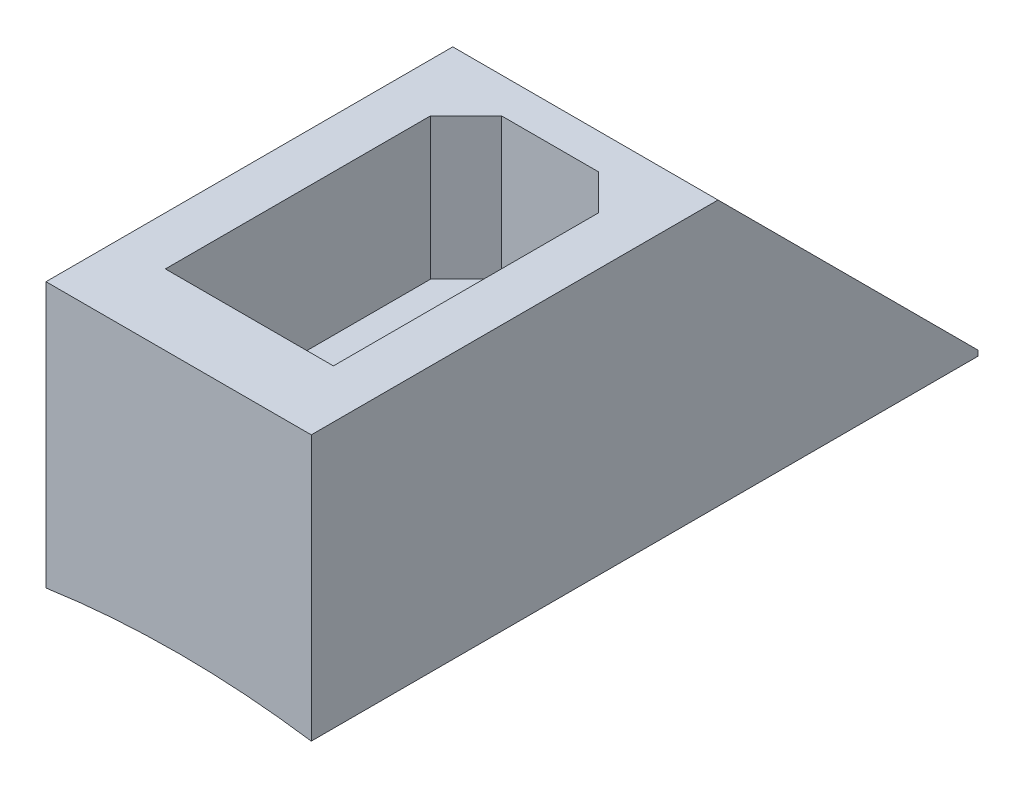
ISO-10303-21;
HEADER;
FILE_DESCRIPTION(('STEP AP214'),'2;1');
FILE_NAME('part.step','',(''),(''),'','','');
FILE_SCHEMA(('AUTOMOTIVE_DESIGN { 1 0 10303 214 1 1 1 1 }'));
ENDSEC;
DATA;
#1=APPLICATION_CONTEXT('core data for automotive mechanical design processes');
#2=APPLICATION_PROTOCOL_DEFINITION('international standard','automotive_design',2000,#1);
#3=PRODUCT_CONTEXT('',#1,'mechanical');
#4=PRODUCT('Part','Part','',(#3));
#5=PRODUCT_RELATED_PRODUCT_CATEGORY('part','',(#4));
#6=PRODUCT_DEFINITION_FORMATION('','',#4);
#7=PRODUCT_DEFINITION_CONTEXT('part definition',#1,'design');
#8=PRODUCT_DEFINITION('design','',#6,#7);
#9=PRODUCT_DEFINITION_SHAPE('','',#8);
#10=(LENGTH_UNIT() NAMED_UNIT(*) SI_UNIT(.MILLI.,.METRE.));
#11=(NAMED_UNIT(*) PLANE_ANGLE_UNIT() SI_UNIT($,.RADIAN.));
#12=(NAMED_UNIT(*) SI_UNIT($,.STERADIAN.) SOLID_ANGLE_UNIT());
#13=UNCERTAINTY_MEASURE_WITH_UNIT(LENGTH_MEASURE(1.E-05),#10,'distance_accuracy_value','');
#14=(GEOMETRIC_REPRESENTATION_CONTEXT(3) GLOBAL_UNCERTAINTY_ASSIGNED_CONTEXT((#13)) GLOBAL_UNIT_ASSIGNED_CONTEXT((#10,
#11,#12)) REPRESENTATION_CONTEXT('',''));
#15=CARTESIAN_POINT('',(0.,0.,0.));
#16=DIRECTION('',(0.,0.,1.));
#17=DIRECTION('',(1.,0.,0.));
#18=AXIS2_PLACEMENT_3D('',#15,#16,#17);
#19=CARTESIAN_POINT('',(7.5,-42.0748485916022,-12.7));
#20=DIRECTION('',(0.,0.,-1.));
#21=DIRECTION('',(-1.,0.,0.));
#22=AXIS2_PLACEMENT_3D('',#19,#20,#21);
#23=PLANE('',#22);
#24=DIRECTION('',(0.,1.,0.));
#25=VECTOR('',#24,1.);
#26=CARTESIAN_POINT('',(0.,23.9387755102041,-12.7));
#27=LINE('',#26,#25);
#28=CARTESIAN_POINT('',(0.,8.93877551020407,-12.7));
#29=VERTEX_POINT('',#28);
#30=CARTESIAN_POINT('',(0.,9.23877551020381,-12.7));
#31=VERTEX_POINT('',#30);
#32=EDGE_CURVE('E150',#29,#31,#27,.T.);
#33=ORIENTED_EDGE('',*,*,#32,.T.);
#34=DIRECTION('',(1.,0.,0.));
#35=VECTOR('',#34,1.);
#36=CARTESIAN_POINT('',(15.,9.23877551020381,-12.7));
#37=LINE('',#36,#35);
#38=CARTESIAN_POINT('',(2.44511864244638,9.23877551020381,-12.7));
#39=VERTEX_POINT('',#38);
#40=EDGE_CURVE('E262',#31,#39,#37,.T.);
#41=ORIENTED_EDGE('',*,*,#40,.T.);
#42=CARTESIAN_POINT('',(7.5,-42.0748485916022,-12.7));
#43=DIRECTION('',(0.,0.,1.));
#44=DIRECTION('',(-1.,0.,0.));
#45=AXIS2_PLACEMENT_3D('',#42,#43,#44);
#46=CIRCLE('',#45,51.5620000000038);
#47=EDGE_CURVE('E136',#39,#29,#46,.T.);
#48=ORIENTED_EDGE('',*,*,#47,.T.);
#49=EDGE_LOOP('',(#33,#41,#48));
#50=FACE_BOUND('',#49,.T.);
#51=ADVANCED_FACE('F39',(#50),#23,.T.);
#52=CARTESIAN_POINT('',(7.5,8.93877551020407,16.175));
#53=DIRECTION('',(0.,1.,0.));
#54=DIRECTION('',(0.,0.,1.));
#55=AXIS2_PLACEMENT_3D('',#52,#53,#54);
#56=CYLINDRICAL_SURFACE('',#55,2.75);
#57=CARTESIAN_POINT('',(7.5,9.48715140840162,18.925));
#58=CARTESIAN_POINT('',(7.65435097895577,9.48715042879058,18.9249931929181));
#59=CARTESIAN_POINT('',(7.80881107965169,9.48645091312312,18.9119613177398));
#60=CARTESIAN_POINT('',(8.11346929754863,9.48372765547839,18.8601599459866));
#61=CARTESIAN_POINT('',(8.26366219171289,9.48170235794201,18.8213602148341));
#62=CARTESIAN_POINT('',(8.55532870499744,9.4765567382875,18.7191380401168));
#63=CARTESIAN_POINT('',(8.69680676272525,9.47343697910908,18.6557282530306));
#64=CARTESIAN_POINT('',(8.96707282803915,9.46645368008504,18.5061056515496));
#65=CARTESIAN_POINT('',(9.09586379963759,9.46259031458997,18.4198981806725));
#66=CARTESIAN_POINT('',(9.33728329279081,9.45454944362787,18.2270194427513));
#67=CARTESIAN_POINT('',(9.44989567430701,9.45037163070635,18.1203279849908));
#68=CARTESIAN_POINT('',(9.65562364501314,9.44217537337076,17.8895505811323));
#69=CARTESIAN_POINT('',(9.74873843335047,9.43815693550842,17.7654639208856));
#70=CARTESIAN_POINT('',(9.91287419703132,9.43073033923021,17.5033316683625));
#71=CARTESIAN_POINT('',(9.98388231326114,9.42732253649877,17.3652780133238));
#72=CARTESIAN_POINT('',(10.1017066470424,9.42150532292135,17.0791872947789));
#73=CARTESIAN_POINT('',(10.1485230668944,9.41909590372651,16.931150314769));
#74=CARTESIAN_POINT('',(10.2165917329869,9.41554999085338,16.6294459045482));
#75=CARTESIAN_POINT('',(10.2378684931383,9.41441227661788,16.4757840195878));
#76=CARTESIAN_POINT('',(10.2543295160921,9.41353441043193,16.1670658180619));
#77=CARTESIAN_POINT('',(10.2495140067396,9.41379424627768,16.0120095136848));
#78=CARTESIAN_POINT('',(10.2139475826552,9.41568104474991,15.7050706766574));
#79=CARTESIAN_POINT('',(10.1832231635176,9.41730661071425,15.553185064064));
#80=CARTESIAN_POINT('',(10.0967521424871,9.42173945894075,15.2567302733335));
#81=CARTESIAN_POINT('',(10.0410054240059,9.42454674670901,15.1121611292901));
#82=CARTESIAN_POINT('',(9.90604203362947,9.43102825278204,14.8343577581608));
#83=CARTESIAN_POINT('',(9.82681329690256,9.43470291653804,14.7011294032665));
#84=CARTESIAN_POINT('',(9.64714365934119,9.44250456684383,14.4498536924823));
#85=CARTESIAN_POINT('',(9.54670258704188,9.44663155704976,14.3318064593177));
#86=CARTESIAN_POINT('',(9.3273099842487,9.4548789312021,14.1140897211129));
#87=CARTESIAN_POINT('',(9.2083355130222,9.4589993004797,14.0144433313669));
#88=CARTESIAN_POINT('',(8.9553339342862,9.46676408594595,13.8365350385265));
#89=CARTESIAN_POINT('',(8.82130682273158,9.47040850200671,13.7582731411789));
#90=CARTESIAN_POINT('',(8.54199085559443,9.47681085492425,13.6253575528161));
#91=CARTESIAN_POINT('',(8.39670160739012,9.47956876085816,13.5707046852984));
#92=CARTESIAN_POINT('',(8.09899165710637,9.48388684287899,13.4865737408279));
#93=CARTESIAN_POINT('',(7.94657101574728,9.48544702916194,13.457095449567));
#94=CARTESIAN_POINT('',(7.63912558388247,9.48719253164091,13.4241789649785));
#95=CARTESIAN_POINT('',(7.4841042253125,9.48737953575447,13.4207088023124));
#96=CARTESIAN_POINT('',(7.17568146356683,9.48636208243199,13.439823625827));
#97=CARTESIAN_POINT('',(7.02228005428412,9.48515763024347,13.462408513748));
#98=CARTESIAN_POINT('',(6.72154139293456,9.48149399428106,13.5329658736579));
#99=CARTESIAN_POINT('',(6.57420070258586,9.47903553282617,13.580923731212));
#100=CARTESIAN_POINT('',(6.28965997376305,9.47314061708192,13.7008508604269));
#101=CARTESIAN_POINT('',(6.15246000176205,9.46970415638242,13.7728202894682));
#102=CARTESIAN_POINT('',(5.89194861665342,9.46223551030648,13.9388093493237));
#103=CARTESIAN_POINT('',(5.76865086268431,9.45820274789089,14.0328503911174));
#104=CARTESIAN_POINT('',(5.53958126313574,9.44999751485844,14.2402819432382));
#105=CARTESIAN_POINT('',(5.43380954467566,9.44582504322852,14.3536725938993));
#106=CARTESIAN_POINT('',(5.24268669267917,9.43780583435452,14.5967222469676));
#107=CARTESIAN_POINT('',(5.15735625715243,9.43395942979692,14.7263975377833));
#108=CARTESIAN_POINT('',(5.00967967890251,9.42703134890772,14.9982532746573));
#109=CARTESIAN_POINT('',(4.94733342587105,9.423949668906,15.1404336606957));
#110=CARTESIAN_POINT('',(4.84743102396193,9.41890093097206,15.4331871922195));
#111=CARTESIAN_POINT('',(4.80986172133218,9.41693328169446,15.5837558383698));
#112=CARTESIAN_POINT('',(4.76053666884104,9.41433283608672,15.88907464633));
#113=CARTESIAN_POINT('',(4.74878074563551,9.41370003079273,16.0438247800531));
#114=CARTESIAN_POINT('',(4.75141779420301,9.41384085297849,16.3529078127267));
#115=CARTESIAN_POINT('',(4.76577821088679,9.41461272946554,16.5072409912899));
#116=CARTESIAN_POINT('',(4.82017295351543,9.41747222009253,16.8113018346929));
#117=CARTESIAN_POINT('',(4.86020732785864,9.41955983671278,16.9610294908502));
#118=CARTESIAN_POINT('',(4.96480671044008,9.42481512162699,17.2516353464725));
#119=CARTESIAN_POINT('',(5.02937182481094,9.42798279459382,17.3925135076469));
#120=CARTESIAN_POINT('',(5.1811946777554,9.43504109497196,17.6614330106267));
#121=CARTESIAN_POINT('',(5.26845174670824,9.43893170104915,17.7894747310704));
#122=CARTESIAN_POINT('',(5.46329947349179,9.44700295399372,18.0292501624672));
#123=CARTESIAN_POINT('',(5.57091310812096,9.45118392519321,18.1409651901597));
#124=CARTESIAN_POINT('',(5.80339872861173,9.45936225115668,18.3447796450952));
#125=CARTESIAN_POINT('',(5.92827494794828,9.46335956055809,18.4368742465046));
#126=CARTESIAN_POINT('',(6.19184971833319,9.47072323184012,18.59888269433));
#127=CARTESIAN_POINT('',(6.33056231897978,9.47408894219181,18.6687736874338));
#128=CARTESIAN_POINT('',(6.61766796202361,9.47980070468509,18.7841902664387));
#129=CARTESIAN_POINT('',(6.7660493611001,9.48214795809221,18.8297445721106));
#130=CARTESIAN_POINT('',(7.01279103323716,9.48493888018015,18.8832723426892));
#131=CARTESIAN_POINT('',(7.10955389516987,9.48576492190564,18.8989001740057));
#132=CARTESIAN_POINT('',(7.3041965319372,9.48687149649271,18.9197661568545));
#133=CARTESIAN_POINT('',(7.40207630567765,9.48715202988865,18.9250043185642));
#134=CARTESIAN_POINT('',(7.5,9.48715140840162,18.925));
#135=B_SPLINE_CURVE_WITH_KNOTS('',3,(#57,#58,#59,#60,#61,#62,#63,#64,#65,#66,#67,#68,#69,#70,
#71,#72,#73,#74,#75,#76,#77,#78,#79,#80,#81,#82,#83,#84,#85,#86,#87,#88,#89,#90,#91,#92,#93,#94,
#95,#96,#97,#98,#99,#100,#101,#102,#103,#104,#105,#106,#107,#108,#109,#110,#111,#112,#113,#114,
#115,#116,#117,#118,#119,#120,#121,#122,#123,#124,#125,#126,#127,#128,#129,#130,#131,#132,#133,
#134),.UNSPECIFIED.,.T.,.F.,(4,2,2,2,2,2,2,2,2,2,2,2,2,2,2,2,2,2,2,2,2,2,2,2,2,2,2,2,2,2,2,2,2,
2,2,2,2,2,4),(0.,0.462695473602192,0.925934809935523,1.38893622619541,1.8518292162303,
2.31518083643747,2.77855148481821,3.2421911673917,3.70582697276263,4.16901740656119,
4.63220379565511,5.09491708353755,5.55763252740025,6.02058612329231,6.4835434615023,
6.94707847205072,7.41061360716591,7.87416490936518,8.33771226536815,8.80068973274695,
9.26366545413536,9.72637479858098,10.1890871758488,10.6522502847816,11.1154167529703,
11.5790502408673,12.0426815036128,12.5060664321518,12.9694482489203,13.4322528371115,
13.895058297745,14.3578657607361,14.8206595682119,15.2839788898719,15.7474120381708,
16.2113206463371,16.6746805789472,16.9682251668143,17.2617694671349),.UNSPECIFIED.);
#136=CARTESIAN_POINT('',(7.5,9.48715140840162,18.925));
#137=VERTEX_POINT('',#136);
#138=EDGE_CURVE('E186',#137,#137,#135,.T.);
#139=ORIENTED_EDGE('',*,*,#138,.F.);
#140=EDGE_LOOP('',(#139));
#141=FACE_BOUND('',#140,.T.);
#142=CARTESIAN_POINT('',(7.5,15.9387755102041,16.175));
#143=DIRECTION('',(0.,1.,0.));
#144=DIRECTION('',(0.,0.,1.));
#145=AXIS2_PLACEMENT_3D('',#142,#143,#144);
#146=CIRCLE('',#145,2.75);
#147=CARTESIAN_POINT('',(7.5,15.9387755102041,18.925));
#148=VERTEX_POINT('',#147);
#149=EDGE_CURVE('E183',#148,#148,#146,.F.);
#150=ORIENTED_EDGE('',*,*,#149,.F.);
#151=EDGE_LOOP('',(#150));
#152=FACE_BOUND('',#151,.T.);
#153=ADVANCED_FACE('F216',(#141,#152),#56,.F.);
#154=CARTESIAN_POINT('',(7.5,8.93877551020407,8.825));
#155=DIRECTION('',(0.,1.,0.));
#156=DIRECTION('',(0.,0.,1.));
#157=AXIS2_PLACEMENT_3D('',#154,#155,#156);
#158=CYLINDRICAL_SURFACE('',#157,2.75);
#159=CARTESIAN_POINT('',(7.5,9.48715140840162,11.575));
#160=CARTESIAN_POINT('',(7.65435097895577,9.48715042879058,11.5749931929181));
#161=CARTESIAN_POINT('',(7.80881107965169,9.48645091312312,11.5619613177398));
#162=CARTESIAN_POINT('',(8.11346929754863,9.48372765547839,11.5101599459866));
#163=CARTESIAN_POINT('',(8.26366219171289,9.48170235794201,11.4713602148341));
#164=CARTESIAN_POINT('',(8.55532870499744,9.4765567382875,11.3691380401168));
#165=CARTESIAN_POINT('',(8.69680676272524,9.47343697910908,11.3057282530306));
#166=CARTESIAN_POINT('',(8.96707282803915,9.46645368008505,11.1561056515496));
#167=CARTESIAN_POINT('',(9.09586379963759,9.46259031458997,11.0698981806725));
#168=CARTESIAN_POINT('',(9.33728329279081,9.45454944362787,10.8770194427513));
#169=CARTESIAN_POINT('',(9.44989567430701,9.45037163070635,10.7703279849908));
#170=CARTESIAN_POINT('',(9.65562364501314,9.44217537337076,10.5395505811323));
#171=CARTESIAN_POINT('',(9.74873843335047,9.43815693550841,10.4154639208856));
#172=CARTESIAN_POINT('',(9.91287419703132,9.43073033923021,10.1533316683625));
#173=CARTESIAN_POINT('',(9.98388231326115,9.42732253649878,10.0152780133238));
#174=CARTESIAN_POINT('',(10.1017066470424,9.42150532292136,9.72918729477885));
#175=CARTESIAN_POINT('',(10.1485230668944,9.41909590372652,9.58115031476895));
#176=CARTESIAN_POINT('',(10.2165917329869,9.41554999085338,9.27944590454819));
#177=CARTESIAN_POINT('',(10.2378684931383,9.41441227661788,9.12578401958776));
#178=CARTESIAN_POINT('',(10.2543295160921,9.41353441043193,8.81706581806195));
#179=CARTESIAN_POINT('',(10.2495140067396,9.41379424627768,8.66200951368484));
#180=CARTESIAN_POINT('',(10.2139475826552,9.41568104474991,8.35507067665737));
#181=CARTESIAN_POINT('',(10.1832231635176,9.41730661071424,8.20318506406405));
#182=CARTESIAN_POINT('',(10.0967521424871,9.42173945894075,7.90673027333355));
#183=CARTESIAN_POINT('',(10.0410054240059,9.42454674670901,7.76216112929008));
#184=CARTESIAN_POINT('',(9.90604203362948,9.43102825278204,7.48435775816076));
#185=CARTESIAN_POINT('',(9.82681329690256,9.43470291653804,7.35112940326651));
#186=CARTESIAN_POINT('',(9.64714365934119,9.44250456684383,7.09985369248229));
#187=CARTESIAN_POINT('',(9.54670258704188,9.44663155704976,6.98180645931771));
#188=CARTESIAN_POINT('',(9.3273099842487,9.4548789312021,6.7640897211129));
#189=CARTESIAN_POINT('',(9.2083355130222,9.4589993004797,6.66444333136686));
#190=CARTESIAN_POINT('',(8.9553339342862,9.46676408594595,6.48653503852649));
#191=CARTESIAN_POINT('',(8.82130682273159,9.47040850200671,6.40827314117887));
#192=CARTESIAN_POINT('',(8.54199085559443,9.47681085492425,6.27535755281611));
#193=CARTESIAN_POINT('',(8.39670160739012,9.47956876085816,6.2207046852984));
#194=CARTESIAN_POINT('',(8.09899165710637,9.483886842879,6.13657374082794));
#195=CARTESIAN_POINT('',(7.94657101574727,9.48544702916195,6.10709544956703));
#196=CARTESIAN_POINT('',(7.63912558388247,9.48719253164091,6.07417896497851));
#197=CARTESIAN_POINT('',(7.4841042253125,9.48737953575446,6.07070880231238));
#198=CARTESIAN_POINT('',(7.17568146356683,9.48636208243199,6.08982362582697));
#199=CARTESIAN_POINT('',(7.02228005428412,9.48515763024346,6.11240851374802));
#200=CARTESIAN_POINT('',(6.72154139293456,9.48149399428105,6.18296587365787));
#201=CARTESIAN_POINT('',(6.57420070258586,9.47903553282617,6.23092373121199));
#202=CARTESIAN_POINT('',(6.28965997376305,9.47314061708192,6.35085086042694));
#203=CARTESIAN_POINT('',(6.15246000176205,9.46970415638243,6.42282028946819));
#204=CARTESIAN_POINT('',(5.89194861665342,9.46223551030649,6.5888093493237));
#205=CARTESIAN_POINT('',(5.76865086268431,9.45820274789089,6.68285039111736));
#206=CARTESIAN_POINT('',(5.53958126313574,9.44999751485844,6.89028194323817));
#207=CARTESIAN_POINT('',(5.43380954467567,9.44582504322852,7.0036725938993));
#208=CARTESIAN_POINT('',(5.24268669267917,9.43780583435452,7.24672224696761));
#209=CARTESIAN_POINT('',(5.15735625715243,9.43395942979692,7.37639753778334));
#210=CARTESIAN_POINT('',(5.00967967890251,9.42703134890772,7.64825327465733));
#211=CARTESIAN_POINT('',(4.94733342587105,9.423949668906,7.79043366069567));
#212=CARTESIAN_POINT('',(4.84743102396193,9.41890093097206,8.08318719221949));
#213=CARTESIAN_POINT('',(4.80986172133218,9.41693328169446,8.23375583836979));
#214=CARTESIAN_POINT('',(4.76053666884104,9.41433283608672,8.53907464633004));
#215=CARTESIAN_POINT('',(4.74878074563551,9.41370003079273,8.69382478005307));
#216=CARTESIAN_POINT('',(4.75141779420301,9.41384085297849,9.0029078127267));
#217=CARTESIAN_POINT('',(4.76577821088679,9.41461272946554,9.15724099128986));
#218=CARTESIAN_POINT('',(4.82017295351543,9.41747222009253,9.46130183469286));
#219=CARTESIAN_POINT('',(4.86020732785864,9.41955983671279,9.61102949085021));
#220=CARTESIAN_POINT('',(4.96480671044008,9.42481512162699,9.9016353464725));
#221=CARTESIAN_POINT('',(5.02937182481094,9.42798279459382,10.0425135076469));
#222=CARTESIAN_POINT('',(5.1811946777554,9.43504109497196,10.3114330106267));
#223=CARTESIAN_POINT('',(5.26845174670824,9.43893170104915,10.4394747310704));
#224=CARTESIAN_POINT('',(5.46329947349179,9.44700295399372,10.6792501624672));
#225=CARTESIAN_POINT('',(5.57091310812096,9.45118392519321,10.7909651901597));
#226=CARTESIAN_POINT('',(5.80339872861173,9.45936225115668,10.9947796450952));
#227=CARTESIAN_POINT('',(5.92827494794828,9.46335956055809,11.0868742465046));
#228=CARTESIAN_POINT('',(6.19184971833319,9.47072323184012,11.24888269433));
#229=CARTESIAN_POINT('',(6.33056231897978,9.47408894219181,11.3187736874338));
#230=CARTESIAN_POINT('',(6.61766796202361,9.47980070468509,11.4341902664387));
#231=CARTESIAN_POINT('',(6.7660493611001,9.48214795809221,11.4797445721106));
#232=CARTESIAN_POINT('',(7.01279103323716,9.48493888018015,11.5332723426892));
#233=CARTESIAN_POINT('',(7.10955389516987,9.48576492190564,11.5489001740057));
#234=CARTESIAN_POINT('',(7.3041965319372,9.48687149649271,11.5697661568545));
#235=CARTESIAN_POINT('',(7.40207630567765,9.48715202988865,11.5750043185642));
#236=CARTESIAN_POINT('',(7.5,9.48715140840162,11.575));
#237=B_SPLINE_CURVE_WITH_KNOTS('',3,(#159,#160,#161,#162,#163,#164,#165,#166,#167,#168,#169,
#170,#171,#172,#173,#174,#175,#176,#177,#178,#179,#180,#181,#182,#183,#184,#185,#186,#187,#188,
#189,#190,#191,#192,#193,#194,#195,#196,#197,#198,#199,#200,#201,#202,#203,#204,#205,#206,#207,
#208,#209,#210,#211,#212,#213,#214,#215,#216,#217,#218,#219,#220,#221,#222,#223,#224,#225,#226,
#227,#228,#229,#230,#231,#232,#233,#234,#235,#236),.UNSPECIFIED.,.T.,.F.,(4,2,2,2,2,2,2,2,2,2,2,
2,2,2,2,2,2,2,2,2,2,2,2,2,2,2,2,2,2,2,2,2,2,2,2,2,2,2,4),(0.,0.462695473602192,
0.925934809935522,1.38893622619541,1.8518292162303,2.31518083643747,2.77855148481821,
3.2421911673917,3.70582697276264,4.16901740656119,4.6322037956551,5.09491708353755,
5.55763252740025,6.02058612329232,6.4835434615023,6.94707847205072,7.41061360716591,
7.87416490936518,8.33771226536815,8.80068973274695,9.26366545413537,9.72637479858099,
10.1890871758488,10.6522502847816,11.1154167529703,11.5790502408673,12.0426815036128,
12.5060664321518,12.9694482489203,13.4322528371115,13.895058297745,14.3578657607361,
14.8206595682119,15.2839788898719,15.7474120381709,16.2113206463371,16.6746805789472,
16.9682251668144,17.2617694671349),.UNSPECIFIED.);
#238=CARTESIAN_POINT('',(7.5,9.48715140840162,11.575));
#239=VERTEX_POINT('',#238);
#240=EDGE_CURVE('E188',#239,#239,#237,.T.);
#241=ORIENTED_EDGE('',*,*,#240,.F.);
#242=EDGE_LOOP('',(#241));
#243=FACE_BOUND('',#242,.T.);
#244=CARTESIAN_POINT('',(7.5,15.9387755102041,8.825));
#245=DIRECTION('',(0.,1.,0.));
#246=DIRECTION('',(0.,0.,1.));
#247=AXIS2_PLACEMENT_3D('',#244,#245,#246);
#248=CIRCLE('',#247,2.75);
#249=CARTESIAN_POINT('',(7.5,15.9387755102041,11.575));
#250=VERTEX_POINT('',#249);
#251=EDGE_CURVE('E180',#250,#250,#248,.F.);
#252=ORIENTED_EDGE('',*,*,#251,.F.);
#253=EDGE_LOOP('',(#252));
#254=FACE_BOUND('',#253,.T.);
#255=ADVANCED_FACE('F219',(#243,#254),#158,.F.);
#256=CARTESIAN_POINT('',(0.,0.,25.));
#257=DIRECTION('',(1.,0.,0.));
#258=DIRECTION('',(0.,0.,-1.));
#259=AXIS2_PLACEMENT_3D('',#256,#257,#258);
#260=PLANE('',#259);
#261=DIRECTION('',(0.,0.,-1.));
#262=VECTOR('',#261,1.);
#263=CARTESIAN_POINT('',(0.,23.9387755102041,25.));
#264=LINE('',#263,#262);
#265=CARTESIAN_POINT('',(0.,23.9387755102041,25.));
#266=VERTEX_POINT('',#265);
#267=CARTESIAN_POINT('',(0.,23.9387755102041,2.00000000000011));
#268=VERTEX_POINT('',#267);
#269=EDGE_CURVE('E197',#266,#268,#264,.T.);
#270=ORIENTED_EDGE('',*,*,#269,.T.);
#271=DIRECTION('',(0.,-0.707106781186551,-0.707106781186544));
#272=VECTOR('',#271,1.);
#273=CARTESIAN_POINT('',(0.,9.23877551020381,-12.7));
#274=LINE('',#273,#272);
#275=EDGE_CURVE('E11',#268,#31,#274,.T.);
#276=ORIENTED_EDGE('',*,*,#275,.T.);
#277=ORIENTED_EDGE('',*,*,#32,.F.);
#278=DIRECTION('',(0.,0.,1.));
#279=VECTOR('',#278,1.);
#280=CARTESIAN_POINT('',(0.,8.93877551020407,0.));
#281=LINE('',#280,#279);
#282=CARTESIAN_POINT('',(0.,8.93877551020407,25.));
#283=VERTEX_POINT('',#282);
#284=EDGE_CURVE('E145',#29,#283,#281,.T.);
#285=ORIENTED_EDGE('',*,*,#284,.T.);
#286=DIRECTION('',(0.,-1.,0.));
#287=VECTOR('',#286,1.);
#288=CARTESIAN_POINT('',(0.,0.,25.));
#289=LINE('',#288,#287);
#290=EDGE_CURVE('E144',#266,#283,#289,.T.);
#291=ORIENTED_EDGE('',*,*,#290,.F.);
#292=EDGE_LOOP('',(#270,#276,#277,#285,#291));
#293=FACE_BOUND('',#292,.T.);
#294=ADVANCED_FACE('F224',(#293),#260,.F.);
#295=CARTESIAN_POINT('',(15.,0.,25.));
#296=DIRECTION('',(-1.,0.,0.));
#297=DIRECTION('',(0.,0.,1.));
#298=AXIS2_PLACEMENT_3D('',#295,#296,#297);
#299=PLANE('',#298);
#300=DIRECTION('',(0.,-1.,0.));
#301=VECTOR('',#300,1.);
#302=CARTESIAN_POINT('',(15.,8.93877551020407,-12.7));
#303=LINE('',#302,#301);
#304=CARTESIAN_POINT('',(15.,9.23877551020381,-12.7));
#305=VERTEX_POINT('',#304);
#306=CARTESIAN_POINT('',(15.,8.93877551020407,-12.7));
#307=VERTEX_POINT('',#306);
#308=EDGE_CURVE('E129',#305,#307,#303,.T.);
#309=ORIENTED_EDGE('',*,*,#308,.F.);
#310=DIRECTION('',(0.,0.707106781186551,0.707106781186544));
#311=VECTOR('',#310,1.);
#312=CARTESIAN_POINT('',(15.,9.23877551020381,-12.7));
#313=LINE('',#312,#311);
#314=CARTESIAN_POINT('',(15.,23.9387755102041,2.00000000000011));
#315=VERTEX_POINT('',#314);
#316=EDGE_CURVE('E62',#305,#315,#313,.T.);
#317=ORIENTED_EDGE('',*,*,#316,.T.);
#318=DIRECTION('',(0.,0.,-1.));
#319=VECTOR('',#318,1.);
#320=CARTESIAN_POINT('',(15.,23.9387755102041,25.));
#321=LINE('',#320,#319);
#322=CARTESIAN_POINT('',(15.,23.9387755102041,25.));
#323=VERTEX_POINT('',#322);
#324=EDGE_CURVE('E199',#323,#315,#321,.T.);
#325=ORIENTED_EDGE('',*,*,#324,.F.);
#326=DIRECTION('',(0.,1.,0.));
#327=VECTOR('',#326,1.);
#328=CARTESIAN_POINT('',(15.,0.,25.));
#329=LINE('',#328,#327);
#330=CARTESIAN_POINT('',(15.,8.93877551020407,25.));
#331=VERTEX_POINT('',#330);
#332=EDGE_CURVE('E141',#331,#323,#329,.T.);
#333=ORIENTED_EDGE('',*,*,#332,.F.);
#334=DIRECTION('',(0.,0.,1.));
#335=VECTOR('',#334,1.);
#336=CARTESIAN_POINT('',(15.,8.93877551020407,0.));
#337=LINE('',#336,#335);
#338=EDGE_CURVE('E139',#307,#331,#337,.T.);
#339=ORIENTED_EDGE('',*,*,#338,.F.);
#340=EDGE_LOOP('',(#309,#317,#325,#333,#339));
#341=FACE_BOUND('',#340,.T.);
#342=ADVANCED_FACE('F140',(#341),#299,.F.);
#343=CARTESIAN_POINT('',(0.,23.9387755102041,25.));
#344=DIRECTION('',(0.,-1.,0.));
#345=DIRECTION('',(0.,0.,-1.));
#346=AXIS2_PLACEMENT_3D('',#343,#344,#345);
#347=PLANE('',#346);
#348=DIRECTION('',(1.,0.,0.));
#349=VECTOR('',#348,1.);
#350=CARTESIAN_POINT('',(2.75000000000001,23.9387755102041,21.));
#351=LINE('',#350,#349);
#352=CARTESIAN_POINT('',(2.75000000000001,23.9387755102041,21.));
#353=VERTEX_POINT('',#352);
#354=CARTESIAN_POINT('',(12.25,23.9387755102041,21.));
#355=VERTEX_POINT('',#354);
#356=EDGE_CURVE('E170',#353,#355,#351,.T.);
#357=ORIENTED_EDGE('',*,*,#356,.F.);
#358=DIRECTION('',(0.,0.,1.));
#359=VECTOR('',#358,1.);
#360=CARTESIAN_POINT('',(2.75,23.9387755102041,4.));
#361=LINE('',#360,#359);
#362=CARTESIAN_POINT('',(2.75,23.9387755102041,6.00000000000001));
#363=VERTEX_POINT('',#362);
#364=EDGE_CURVE('E153',#363,#353,#361,.T.);
#365=ORIENTED_EDGE('',*,*,#364,.F.);
#366=DIRECTION('',(-0.707106781186545,0.,0.707106781186551));
#367=VECTOR('',#366,1.);
#368=CARTESIAN_POINT('',(-8.12499999999998,23.9387755102041,16.8750000000001));
#369=LINE('',#368,#367);
#370=CARTESIAN_POINT('',(4.75,23.9387755102041,4.));
#371=VERTEX_POINT('',#370);
#372=EDGE_CURVE('E268',#363,#371,#369,.F.);
#373=ORIENTED_EDGE('',*,*,#372,.T.);
#374=DIRECTION('',(-1.,0.,0.));
#375=VECTOR('',#374,1.);
#376=CARTESIAN_POINT('',(2.75,23.9387755102041,4.));
#377=LINE('',#376,#375);
#378=CARTESIAN_POINT('',(10.25,23.9387755102041,4.));
#379=VERTEX_POINT('',#378);
#380=EDGE_CURVE('E159',#379,#371,#377,.T.);
#381=ORIENTED_EDGE('',*,*,#380,.F.);
#382=DIRECTION('',(-0.707106781186551,0.,-0.707106781186544));
#383=VECTOR('',#382,1.);
#384=CARTESIAN_POINT('',(15.6249999999999,23.9387755102041,9.37499999999991));
#385=LINE('',#384,#383);
#386=CARTESIAN_POINT('',(12.25,23.9387755102041,6.));
#387=VERTEX_POINT('',#386);
#388=EDGE_CURVE('E273',#379,#387,#385,.F.);
#389=ORIENTED_EDGE('',*,*,#388,.T.);
#390=DIRECTION('',(0.,0.,-1.));
#391=VECTOR('',#390,1.);
#392=CARTESIAN_POINT('',(12.25,23.9387755102041,4.00000000000001));
#393=LINE('',#392,#391);
#394=EDGE_CURVE('E173',#355,#387,#393,.T.);
#395=ORIENTED_EDGE('',*,*,#394,.F.);
#396=EDGE_LOOP('',(#357,#365,#373,#381,#389,#395));
#397=FACE_BOUND('',#396,.T.);
#398=ORIENTED_EDGE('',*,*,#324,.T.);
#399=DIRECTION('',(-1.,0.,0.));
#400=VECTOR('',#399,1.);
#401=CARTESIAN_POINT('',(0.,23.9387755102041,2.00000000000011));
#402=LINE('',#401,#400);
#403=EDGE_CURVE('E48',#315,#268,#402,.T.);
#404=ORIENTED_EDGE('',*,*,#403,.T.);
#405=ORIENTED_EDGE('',*,*,#269,.F.);
#406=DIRECTION('',(-1.,0.,0.));
#407=VECTOR('',#406,1.);
#408=CARTESIAN_POINT('',(0.,23.9387755102041,25.));
#409=LINE('',#408,#407);
#410=EDGE_CURVE('E195',#323,#266,#409,.T.);
#411=ORIENTED_EDGE('',*,*,#410,.F.);
#412=EDGE_LOOP('',(#398,#404,#405,#411));
#413=FACE_BOUND('',#412,.T.);
#414=ADVANCED_FACE('F306',(#397,#413),#347,.F.);
#415=CARTESIAN_POINT('',(0.,0.,25.));
#416=DIRECTION('',(0.,0.,-1.));
#417=DIRECTION('',(-1.,0.,0.));
#418=AXIS2_PLACEMENT_3D('',#415,#416,#417);
#419=PLANE('',#418);
#420=ORIENTED_EDGE('',*,*,#290,.T.);
#421=CARTESIAN_POINT('',(7.5,-42.0748485915984,25.));
#422=DIRECTION('',(0.,0.,1.));
#423=DIRECTION('',(-1.,0.,0.));
#424=AXIS2_PLACEMENT_3D('',#421,#422,#423);
#425=CIRCLE('',#424,51.562);
#426=EDGE_CURVE('E187',#331,#283,#425,.T.);
#427=ORIENTED_EDGE('',*,*,#426,.F.);
#428=ORIENTED_EDGE('',*,*,#332,.T.);
#429=ORIENTED_EDGE('',*,*,#410,.T.);
#430=EDGE_LOOP('',(#420,#427,#428,#429));
#431=FACE_BOUND('',#430,.T.);
#432=ADVANCED_FACE('F330',(#431),#419,.F.);
#433=CARTESIAN_POINT('',(7.5,-42.0748485915984,0.));
#434=DIRECTION('',(0.,0.,1.));
#435=DIRECTION('',(1.,0.,0.));
#436=AXIS2_PLACEMENT_3D('',#433,#434,#435);
#437=CYLINDRICAL_SURFACE('',#436,51.562);
#438=ORIENTED_EDGE('',*,*,#240,.T.);
#439=EDGE_LOOP('',(#438));
#440=FACE_BOUND('',#439,.T.);
#441=ORIENTED_EDGE('',*,*,#138,.T.);
#442=EDGE_LOOP('',(#441));
#443=FACE_BOUND('',#442,.T.);
#444=ORIENTED_EDGE('',*,*,#47,.F.);
#445=CARTESIAN_POINT('',(7.5,-42.0748485915984,-64.0136241018017));
#446=DIRECTION('',(0.,0.707106781186544,-0.707106781186551));
#447=DIRECTION('',(0.,0.707106781186551,0.707106781186544));
#448=AXIS2_PLACEMENT_3D('',#445,#446,#447);
#449=ELLIPSE('',#448,72.9196797030811,51.562);
#450=CARTESIAN_POINT('',(12.5548813575536,9.23877551020381,-12.7));
#451=VERTEX_POINT('',#450);
#452=EDGE_CURVE('E149',#39,#451,#449,.T.);
#453=ORIENTED_EDGE('',*,*,#452,.T.);
#454=EDGE_CURVE('E133',#307,#451,#46,.T.);
#455=ORIENTED_EDGE('',*,*,#454,.F.);
#456=ORIENTED_EDGE('',*,*,#338,.T.);
#457=ORIENTED_EDGE('',*,*,#426,.T.);
#458=ORIENTED_EDGE('',*,*,#284,.F.);
#459=EDGE_LOOP('',(#444,#453,#455,#456,#457,#458));
#460=FACE_BOUND('',#459,.T.);
#461=ADVANCED_FACE('F148',(#440,#443,#460),#437,.F.);
#462=CARTESIAN_POINT('',(0.,15.9387755102041,0.));
#463=DIRECTION('',(0.,1.,0.));
#464=DIRECTION('',(0.,0.,1.));
#465=AXIS2_PLACEMENT_3D('',#462,#463,#464);
#466=PLANE('',#465);
#467=DIRECTION('',(0.,0.,-1.));
#468=VECTOR('',#467,1.);
#469=CARTESIAN_POINT('',(12.25,15.9387755102041,4.00000000000001));
#470=LINE('',#469,#468);
#471=CARTESIAN_POINT('',(12.25,15.9387755102041,21.));
#472=VERTEX_POINT('',#471);
#473=CARTESIAN_POINT('',(12.25,15.9387755102041,6.));
#474=VERTEX_POINT('',#473);
#475=EDGE_CURVE('E162',#472,#474,#470,.T.);
#476=ORIENTED_EDGE('',*,*,#475,.T.);
#477=DIRECTION('',(0.707106781186551,0.,0.707106781186544));
#478=VECTOR('',#477,1.);
#479=CARTESIAN_POINT('',(3.12499999999994,15.9387755102041,-3.12499999999997));
#480=LINE('',#479,#478);
#481=CARTESIAN_POINT('',(10.25,15.9387755102041,4.));
#482=VERTEX_POINT('',#481);
#483=EDGE_CURVE('E278',#474,#482,#480,.F.);
#484=ORIENTED_EDGE('',*,*,#483,.T.);
#485=DIRECTION('',(-1.,0.,0.));
#486=VECTOR('',#485,1.);
#487=CARTESIAN_POINT('',(2.75,15.9387755102041,4.));
#488=LINE('',#487,#486);
#489=CARTESIAN_POINT('',(4.75,15.9387755102041,4.));
#490=VERTEX_POINT('',#489);
#491=EDGE_CURVE('E165',#482,#490,#488,.T.);
#492=ORIENTED_EDGE('',*,*,#491,.T.);
#493=DIRECTION('',(0.707106781186544,0.,-0.707106781186551));
#494=VECTOR('',#493,1.);
#495=CARTESIAN_POINT('',(4.37500000000002,15.9387755102041,4.37499999999998));
#496=LINE('',#495,#494);
#497=CARTESIAN_POINT('',(2.75,15.9387755102041,6.00000000000001));
#498=VERTEX_POINT('',#497);
#499=EDGE_CURVE('E280',#490,#498,#496,.F.);
#500=ORIENTED_EDGE('',*,*,#499,.T.);
#501=DIRECTION('',(0.,0.,1.));
#502=VECTOR('',#501,1.);
#503=CARTESIAN_POINT('',(2.75,15.9387755102041,4.));
#504=LINE('',#503,#502);
#505=CARTESIAN_POINT('',(2.75000000000001,15.9387755102041,21.));
#506=VERTEX_POINT('',#505);
#507=EDGE_CURVE('E156',#498,#506,#504,.T.);
#508=ORIENTED_EDGE('',*,*,#507,.T.);
#509=DIRECTION('',(1.,0.,0.));
#510=VECTOR('',#509,1.);
#511=CARTESIAN_POINT('',(2.75000000000001,15.9387755102041,21.));
#512=LINE('',#511,#510);
#513=EDGE_CURVE('E158',#506,#472,#512,.T.);
#514=ORIENTED_EDGE('',*,*,#513,.T.);
#515=EDGE_LOOP('',(#476,#484,#492,#500,#508,#514));
#516=FACE_BOUND('',#515,.T.);
#517=ORIENTED_EDGE('',*,*,#251,.T.);
#518=EDGE_LOOP('',(#517));
#519=FACE_BOUND('',#518,.T.);
#520=ORIENTED_EDGE('',*,*,#149,.T.);
#521=EDGE_LOOP('',(#520));
#522=FACE_BOUND('',#521,.T.);
#523=ADVANCED_FACE('F230',(#516,#519,#522),#466,.T.);
#524=CARTESIAN_POINT('',(2.75,15.9387755102041,4.));
#525=DIRECTION('',(-1.,0.,0.));
#526=DIRECTION('',(0.,0.,1.));
#527=AXIS2_PLACEMENT_3D('',#524,#525,#526);
#528=PLANE('',#527);
#529=ORIENTED_EDGE('',*,*,#507,.F.);
#530=DIRECTION('',(0.,1.,0.));
#531=VECTOR('',#530,1.);
#532=CARTESIAN_POINT('',(2.75,23.9387755102041,6.00000000000001));
#533=LINE('',#532,#531);
#534=EDGE_CURVE('E275',#498,#363,#533,.T.);
#535=ORIENTED_EDGE('',*,*,#534,.T.);
#536=ORIENTED_EDGE('',*,*,#364,.T.);
#537=DIRECTION('',(0.,1.,0.));
#538=VECTOR('',#537,1.);
#539=CARTESIAN_POINT('',(2.75000000000001,15.9387755102041,21.));
#540=LINE('',#539,#538);
#541=EDGE_CURVE('E168',#506,#353,#540,.T.);
#542=ORIENTED_EDGE('',*,*,#541,.F.);
#543=EDGE_LOOP('',(#529,#535,#536,#542));
#544=FACE_BOUND('',#543,.T.);
#545=ADVANCED_FACE('F226',(#544),#528,.F.);
#546=CARTESIAN_POINT('',(2.75,15.9387755102041,4.));
#547=DIRECTION('',(0.,0.,-1.));
#548=DIRECTION('',(-1.,0.,0.));
#549=AXIS2_PLACEMENT_3D('',#546,#547,#548);
#550=PLANE('',#549);
#551=ORIENTED_EDGE('',*,*,#491,.F.);
#552=DIRECTION('',(0.,1.,0.));
#553=VECTOR('',#552,1.);
#554=CARTESIAN_POINT('',(10.25,23.9387755102041,4.));
#555=LINE('',#554,#553);
#556=EDGE_CURVE('E284',#482,#379,#555,.T.);
#557=ORIENTED_EDGE('',*,*,#556,.T.);
#558=ORIENTED_EDGE('',*,*,#380,.T.);
#559=DIRECTION('',(0.,-1.,0.));
#560=VECTOR('',#559,1.);
#561=CARTESIAN_POINT('',(4.75,15.9387755102041,4.));
#562=LINE('',#561,#560);
#563=EDGE_CURVE('E201',#371,#490,#562,.T.);
#564=ORIENTED_EDGE('',*,*,#563,.T.);
#565=EDGE_LOOP('',(#551,#557,#558,#564));
#566=FACE_BOUND('',#565,.T.);
#567=ADVANCED_FACE('F229',(#566),#550,.F.);
#568=CARTESIAN_POINT('',(12.25,15.9387755102041,4.00000000000001));
#569=DIRECTION('',(1.,0.,0.));
#570=DIRECTION('',(0.,0.,-1.));
#571=AXIS2_PLACEMENT_3D('',#568,#569,#570);
#572=PLANE('',#571);
#573=ORIENTED_EDGE('',*,*,#394,.T.);
#574=DIRECTION('',(0.,-1.,0.));
#575=VECTOR('',#574,1.);
#576=CARTESIAN_POINT('',(12.25,15.9387755102041,6.));
#577=LINE('',#576,#575);
#578=EDGE_CURVE('E282',#387,#474,#577,.T.);
#579=ORIENTED_EDGE('',*,*,#578,.T.);
#580=ORIENTED_EDGE('',*,*,#475,.F.);
#581=DIRECTION('',(0.,1.,0.));
#582=VECTOR('',#581,1.);
#583=CARTESIAN_POINT('',(12.25,15.9387755102041,21.));
#584=LINE('',#583,#582);
#585=EDGE_CURVE('E178',#472,#355,#584,.T.);
#586=ORIENTED_EDGE('',*,*,#585,.T.);
#587=EDGE_LOOP('',(#573,#579,#580,#586));
#588=FACE_BOUND('',#587,.T.);
#589=ADVANCED_FACE('F236',(#588),#572,.F.);
#590=CARTESIAN_POINT('',(2.75000000000001,15.9387755102041,21.));
#591=DIRECTION('',(0.,0.,1.));
#592=DIRECTION('',(1.,0.,0.));
#593=AXIS2_PLACEMENT_3D('',#590,#591,#592);
#594=PLANE('',#593);
#595=ORIENTED_EDGE('',*,*,#356,.T.);
#596=ORIENTED_EDGE('',*,*,#585,.F.);
#597=ORIENTED_EDGE('',*,*,#513,.F.);
#598=ORIENTED_EDGE('',*,*,#541,.T.);
#599=EDGE_LOOP('',(#595,#596,#597,#598));
#600=FACE_BOUND('',#599,.T.);
#601=ADVANCED_FACE('F232',(#600),#594,.F.);
#602=CARTESIAN_POINT('',(10.25,15.9387755102041,4.));
#603=DIRECTION('',(-0.707106781186544,0.,0.707106781186551));
#604=DIRECTION('',(0.,-1.,0.));
#605=AXIS2_PLACEMENT_3D('',#602,#603,#604);
#606=PLANE('',#605);
#607=ORIENTED_EDGE('',*,*,#483,.F.);
#608=ORIENTED_EDGE('',*,*,#578,.F.);
#609=ORIENTED_EDGE('',*,*,#388,.F.);
#610=ORIENTED_EDGE('',*,*,#556,.F.);
#611=EDGE_LOOP('',(#607,#608,#609,#610));
#612=FACE_BOUND('',#611,.T.);
#613=ADVANCED_FACE('F235',(#612),#606,.T.);
#614=CARTESIAN_POINT('',(2.75,15.9387755102041,6.00000000000001));
#615=DIRECTION('',(0.70710678118655,0.,0.707106781186544));
#616=DIRECTION('',(0.,-1.,0.));
#617=AXIS2_PLACEMENT_3D('',#614,#615,#616);
#618=PLANE('',#617);
#619=ORIENTED_EDGE('',*,*,#499,.F.);
#620=ORIENTED_EDGE('',*,*,#563,.F.);
#621=ORIENTED_EDGE('',*,*,#372,.F.);
#622=ORIENTED_EDGE('',*,*,#534,.F.);
#623=EDGE_LOOP('',(#619,#620,#621,#622));
#624=FACE_BOUND('',#623,.T.);
#625=ADVANCED_FACE('F248',(#624),#618,.T.);
#626=ORIENTED_EDGE('',*,*,#454,.T.);
#627=DIRECTION('',(1.,0.,0.));
#628=VECTOR('',#627,1.);
#629=CARTESIAN_POINT('',(15.,9.23877551020381,-12.7));
#630=LINE('',#629,#628);
#631=EDGE_CURVE('E135',#451,#305,#630,.T.);
#632=ORIENTED_EDGE('',*,*,#631,.T.);
#633=ORIENTED_EDGE('',*,*,#308,.T.);
#634=EDGE_LOOP('',(#626,#632,#633));
#635=FACE_BOUND('',#634,.T.);
#636=ADVANCED_FACE('F131',(#635),#23,.T.);
#637=CARTESIAN_POINT('',(7.5,9.23877551020381,-12.7));
#638=DIRECTION('',(0.,0.707106781186544,-0.707106781186551));
#639=DIRECTION('',(-1.,0.,0.));
#640=AXIS2_PLACEMENT_3D('',#637,#638,#639);
#641=PLANE('',#640);
#642=ORIENTED_EDGE('',*,*,#275,.F.);
#643=ORIENTED_EDGE('',*,*,#403,.F.);
#644=ORIENTED_EDGE('',*,*,#316,.F.);
#645=ORIENTED_EDGE('',*,*,#631,.F.);
#646=ORIENTED_EDGE('',*,*,#452,.F.);
#647=ORIENTED_EDGE('',*,*,#40,.F.);
#648=EDGE_LOOP('',(#642,#643,#644,#645,#646,#647));
#649=FACE_BOUND('',#648,.T.);
#650=ADVANCED_FACE('F42',(#649),#641,.T.);
#651=CLOSED_SHELL('',(#51,#153,#255,#294,#342,#414,#432,#461,#523,#545,#567,#589,#601,#613,#625,
#636,#650));
#652=MANIFOLD_SOLID_BREP('B2',#651);
#653=ADVANCED_BREP_SHAPE_REPRESENTATION('',(#18,#652),#14);
#654=SHAPE_DEFINITION_REPRESENTATION(#9,#653);
ENDSEC;
END-ISO-10303-21;
